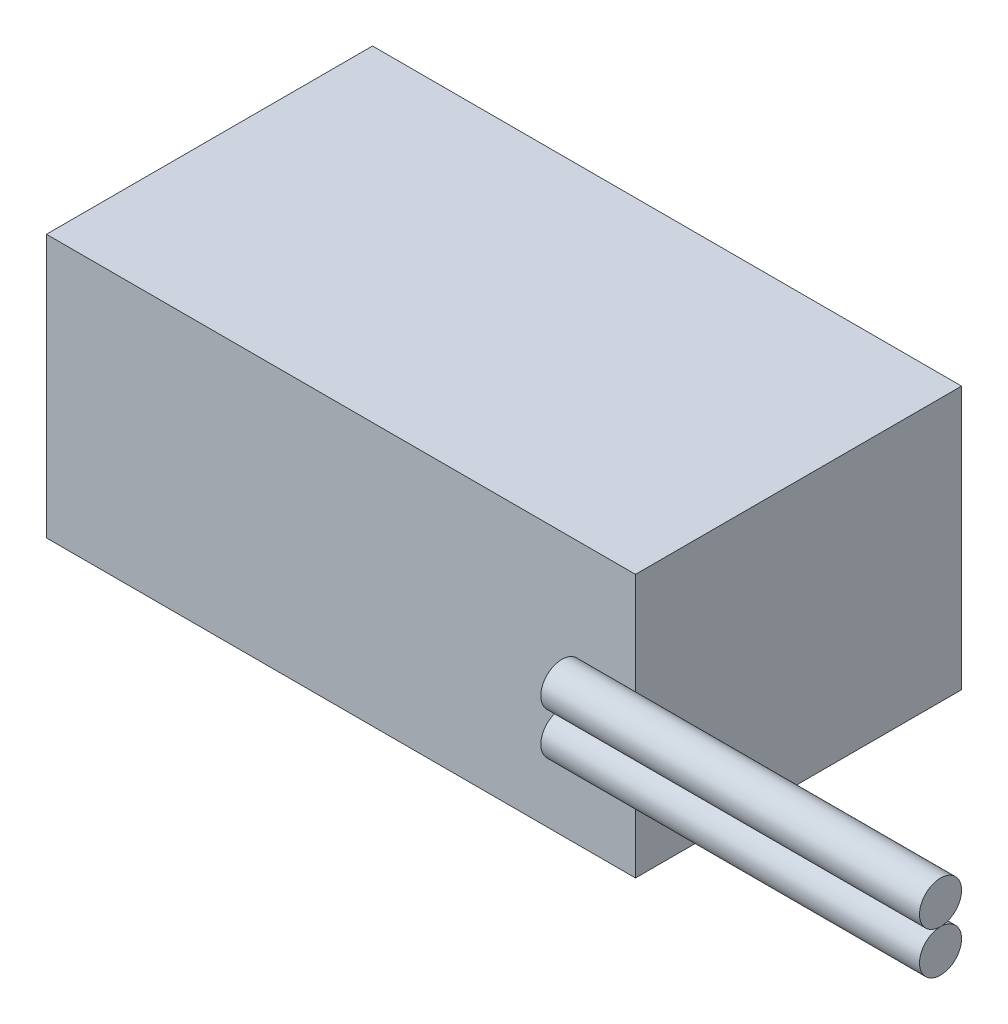
ISO-10303-21;
HEADER;
FILE_DESCRIPTION(('STEP AP214'),'2;1');
FILE_NAME('part.step','',(''),(''),'','','');
FILE_SCHEMA(('AUTOMOTIVE_DESIGN { 1 0 10303 214 1 1 1 1 }'));
ENDSEC;
DATA;
#1=APPLICATION_CONTEXT('core data for automotive mechanical design processes');
#2=APPLICATION_PROTOCOL_DEFINITION('international standard','automotive_design',2000,#1);
#3=PRODUCT_CONTEXT('',#1,'mechanical');
#4=PRODUCT('Part','Part','',(#3));
#5=PRODUCT_RELATED_PRODUCT_CATEGORY('part','',(#4));
#6=PRODUCT_DEFINITION_FORMATION('','',#4);
#7=PRODUCT_DEFINITION_CONTEXT('part definition',#1,'design');
#8=PRODUCT_DEFINITION('design','',#6,#7);
#9=PRODUCT_DEFINITION_SHAPE('','',#8);
#10=(LENGTH_UNIT() NAMED_UNIT(*) SI_UNIT(.MILLI.,.METRE.));
#11=(NAMED_UNIT(*) PLANE_ANGLE_UNIT() SI_UNIT($,.RADIAN.));
#12=(NAMED_UNIT(*) SI_UNIT($,.STERADIAN.) SOLID_ANGLE_UNIT());
#13=UNCERTAINTY_MEASURE_WITH_UNIT(LENGTH_MEASURE(1.E-05),#10,'distance_accuracy_value','');
#14=(GEOMETRIC_REPRESENTATION_CONTEXT(3) GLOBAL_UNCERTAINTY_ASSIGNED_CONTEXT((#13)) GLOBAL_UNIT_ASSIGNED_CONTEXT((#10,
#11,#12)) REPRESENTATION_CONTEXT('',''));
#15=CARTESIAN_POINT('',(0.,0.,0.));
#16=DIRECTION('',(0.,0.,1.));
#17=DIRECTION('',(1.,0.,0.));
#18=AXIS2_PLACEMENT_3D('',#15,#16,#17);
#19=CARTESIAN_POINT('',(59.,-2.,17.5));
#20=DIRECTION('',(-1.,0.,0.));
#21=DIRECTION('',(0.,0.,1.));
#22=AXIS2_PLACEMENT_3D('',#19,#20,#21);
#23=CYLINDRICAL_SURFACE('',#22,2.);
#24=CARTESIAN_POINT('',(59.,-2.,17.5));
#25=DIRECTION('',(1.,0.,0.));
#26=DIRECTION('',(0.,0.,-1.));
#27=AXIS2_PLACEMENT_3D('',#24,#25,#26);
#28=CIRCLE('',#27,2.);
#29=CARTESIAN_POINT('',(59.,-2.,15.5));
#30=VERTEX_POINT('',#29);
#31=EDGE_CURVE('E11',#30,#30,#28,.T.);
#32=ORIENTED_EDGE('',*,*,#31,.F.);
#33=EDGE_LOOP('',(#32));
#34=FACE_BOUND('',#33,.T.);
#35=CARTESIAN_POINT('',(23.,-2.,17.5));
#36=DIRECTION('',(1.,0.,0.));
#37=DIRECTION('',(0.,0.,-1.));
#38=AXIS2_PLACEMENT_3D('',#35,#36,#37);
#39=CIRCLE('',#38,2.);
#40=CARTESIAN_POINT('',(23.,-2.,15.5));
#41=VERTEX_POINT('',#40);
#42=EDGE_CURVE('E50',#41,#41,#39,.T.);
#43=ORIENTED_EDGE('',*,*,#42,.T.);
#44=EDGE_LOOP('',(#43));
#45=FACE_BOUND('',#44,.T.);
#46=ADVANCED_FACE('F44',(#34,#45),#23,.T.);
#47=CARTESIAN_POINT('',(59.,0.,0.));
#48=DIRECTION('',(1.,0.,0.));
#49=DIRECTION('',(0.,0.,-1.));
#50=AXIS2_PLACEMENT_3D('',#47,#48,#49);
#51=PLANE('',#50);
#52=ORIENTED_EDGE('',*,*,#31,.T.);
#53=EDGE_LOOP('',(#52));
#54=FACE_BOUND('',#53,.T.);
#55=ADVANCED_FACE('F59',(#54),#51,.T.);
#56=CARTESIAN_POINT('',(23.,0.,0.));
#57=DIRECTION('',(1.,0.,0.));
#58=DIRECTION('',(0.,0.,-1.));
#59=AXIS2_PLACEMENT_3D('',#56,#57,#58);
#60=PLANE('',#59);
#61=ORIENTED_EDGE('',*,*,#42,.F.);
#62=EDGE_LOOP('',(#61));
#63=FACE_BOUND('',#62,.T.);
#64=ADVANCED_FACE('F57',(#63),#60,.F.);
#65=CLOSED_SHELL('',(#46,#55,#64));
#66=MANIFOLD_SOLID_BREP('B2',#65);
#67=CARTESIAN_POINT('',(59.,2.,17.5));
#68=DIRECTION('',(-1.,0.,0.));
#69=DIRECTION('',(0.,0.,1.));
#70=AXIS2_PLACEMENT_3D('',#67,#68,#69);
#71=CYLINDRICAL_SURFACE('',#70,2.);
#72=CARTESIAN_POINT('',(59.,2.,17.5));
#73=DIRECTION('',(1.,0.,0.));
#74=DIRECTION('',(0.,0.,-1.));
#75=AXIS2_PLACEMENT_3D('',#72,#73,#74);
#76=CIRCLE('',#75,2.);
#77=CARTESIAN_POINT('',(59.,2.,15.5));
#78=VERTEX_POINT('',#77);
#79=EDGE_CURVE('E43',#78,#78,#76,.T.);
#80=ORIENTED_EDGE('',*,*,#79,.F.);
#81=EDGE_LOOP('',(#80));
#82=FACE_BOUND('',#81,.T.);
#83=CARTESIAN_POINT('',(23.,2.,17.5));
#84=DIRECTION('',(1.,0.,0.));
#85=DIRECTION('',(0.,0.,-1.));
#86=AXIS2_PLACEMENT_3D('',#83,#84,#85);
#87=CIRCLE('',#86,2.);
#88=CARTESIAN_POINT('',(23.,2.,15.5));
#89=VERTEX_POINT('',#88);
#90=EDGE_CURVE('E106',#89,#89,#87,.T.);
#91=ORIENTED_EDGE('',*,*,#90,.T.);
#92=EDGE_LOOP('',(#91));
#93=FACE_BOUND('',#92,.T.);
#94=ADVANCED_FACE('F100',(#82,#93),#71,.T.);
#95=CARTESIAN_POINT('',(59.,0.,0.));
#96=DIRECTION('',(1.,0.,0.));
#97=DIRECTION('',(0.,0.,-1.));
#98=AXIS2_PLACEMENT_3D('',#95,#96,#97);
#99=PLANE('',#98);
#100=ORIENTED_EDGE('',*,*,#79,.T.);
#101=EDGE_LOOP('',(#100));
#102=FACE_BOUND('',#101,.T.);
#103=ADVANCED_FACE('F115',(#102),#99,.T.);
#104=CARTESIAN_POINT('',(23.,0.,0.));
#105=DIRECTION('',(1.,0.,0.));
#106=DIRECTION('',(0.,0.,-1.));
#107=AXIS2_PLACEMENT_3D('',#104,#105,#106);
#108=PLANE('',#107);
#109=ORIENTED_EDGE('',*,*,#90,.F.);
#110=EDGE_LOOP('',(#109));
#111=FACE_BOUND('',#110,.T.);
#112=ADVANCED_FACE('F113',(#111),#108,.F.);
#113=CLOSED_SHELL('',(#94,#103,#112));
#114=MANIFOLD_SOLID_BREP('B6',#113);
#115=CARTESIAN_POINT('',(-28.,-12.5,15.5));
#116=DIRECTION('',(1.,0.,0.));
#117=DIRECTION('',(0.,0.,-1.));
#118=AXIS2_PLACEMENT_3D('',#115,#116,#117);
#119=PLANE('',#118);
#120=DIRECTION('',(0.,-1.,0.));
#121=VECTOR('',#120,1.);
#122=CARTESIAN_POINT('',(-28.,-12.5,-15.5));
#123=LINE('',#122,#121);
#124=CARTESIAN_POINT('',(-28.,12.5,-15.5));
#125=VERTEX_POINT('',#124);
#126=CARTESIAN_POINT('',(-28.,-12.5,-15.5));
#127=VERTEX_POINT('',#126);
#128=EDGE_CURVE('E210',#125,#127,#123,.T.);
#129=ORIENTED_EDGE('',*,*,#128,.T.);
#130=DIRECTION('',(0.,0.,-1.));
#131=VECTOR('',#130,1.);
#132=CARTESIAN_POINT('',(-28.,-12.5,15.5));
#133=LINE('',#132,#131);
#134=CARTESIAN_POINT('',(-28.,-12.5,15.5));
#135=VERTEX_POINT('',#134);
#136=EDGE_CURVE('E98',#135,#127,#133,.T.);
#137=ORIENTED_EDGE('',*,*,#136,.F.);
#138=DIRECTION('',(0.,-1.,0.));
#139=VECTOR('',#138,1.);
#140=CARTESIAN_POINT('',(-28.,-12.5,15.5));
#141=LINE('',#140,#139);
#142=CARTESIAN_POINT('',(-28.,12.5,15.5));
#143=VERTEX_POINT('',#142);
#144=EDGE_CURVE('E198',#143,#135,#141,.T.);
#145=ORIENTED_EDGE('',*,*,#144,.F.);
#146=DIRECTION('',(0.,0.,-1.));
#147=VECTOR('',#146,1.);
#148=CARTESIAN_POINT('',(-28.,12.5,15.5));
#149=LINE('',#148,#147);
#150=EDGE_CURVE('E206',#143,#125,#149,.T.);
#151=ORIENTED_EDGE('',*,*,#150,.T.);
#152=EDGE_LOOP('',(#129,#137,#145,#151));
#153=FACE_BOUND('',#152,.T.);
#154=ADVANCED_FACE('F147',(#153),#119,.F.);
#155=CARTESIAN_POINT('',(28.,-12.5,15.5));
#156=DIRECTION('',(0.,1.,0.));
#157=DIRECTION('',(-1.,0.,0.));
#158=AXIS2_PLACEMENT_3D('',#155,#156,#157);
#159=PLANE('',#158);
#160=DIRECTION('',(1.,0.,0.));
#161=VECTOR('',#160,1.);
#162=CARTESIAN_POINT('',(28.,-12.5,-15.5));
#163=LINE('',#162,#161);
#164=CARTESIAN_POINT('',(28.,-12.5,-15.5));
#165=VERTEX_POINT('',#164);
#166=EDGE_CURVE('E202',#127,#165,#163,.T.);
#167=ORIENTED_EDGE('',*,*,#166,.T.);
#168=DIRECTION('',(0.,0.,-1.));
#169=VECTOR('',#168,1.);
#170=CARTESIAN_POINT('',(28.,-12.5,15.5));
#171=LINE('',#170,#169);
#172=CARTESIAN_POINT('',(28.,-12.5,15.5));
#173=VERTEX_POINT('',#172);
#174=EDGE_CURVE('E155',#173,#165,#171,.T.);
#175=ORIENTED_EDGE('',*,*,#174,.F.);
#176=DIRECTION('',(1.,0.,0.));
#177=VECTOR('',#176,1.);
#178=CARTESIAN_POINT('',(28.,-12.5,15.5));
#179=LINE('',#178,#177);
#180=EDGE_CURVE('E193',#135,#173,#179,.T.);
#181=ORIENTED_EDGE('',*,*,#180,.F.);
#182=ORIENTED_EDGE('',*,*,#136,.T.);
#183=EDGE_LOOP('',(#167,#175,#181,#182));
#184=FACE_BOUND('',#183,.T.);
#185=ADVANCED_FACE('F201',(#184),#159,.F.);
#186=CARTESIAN_POINT('',(28.,-12.5,15.5));
#187=DIRECTION('',(-1.,0.,0.));
#188=DIRECTION('',(0.,0.,1.));
#189=AXIS2_PLACEMENT_3D('',#186,#187,#188);
#190=PLANE('',#189);
#191=DIRECTION('',(0.,1.,0.));
#192=VECTOR('',#191,1.);
#193=CARTESIAN_POINT('',(28.,-12.5,-15.5));
#194=LINE('',#193,#192);
#195=CARTESIAN_POINT('',(28.,12.5,-15.5));
#196=VERTEX_POINT('',#195);
#197=EDGE_CURVE('E180',#165,#196,#194,.T.);
#198=ORIENTED_EDGE('',*,*,#197,.T.);
#199=DIRECTION('',(0.,0.,-1.));
#200=VECTOR('',#199,1.);
#201=CARTESIAN_POINT('',(28.,12.5,15.5));
#202=LINE('',#201,#200);
#203=CARTESIAN_POINT('',(28.,12.5,15.5));
#204=VERTEX_POINT('',#203);
#205=EDGE_CURVE('E203',#204,#196,#202,.T.);
#206=ORIENTED_EDGE('',*,*,#205,.F.);
#207=DIRECTION('',(0.,1.,0.));
#208=VECTOR('',#207,1.);
#209=CARTESIAN_POINT('',(28.,-12.5,15.5));
#210=LINE('',#209,#208);
#211=EDGE_CURVE('E196',#173,#204,#210,.T.);
#212=ORIENTED_EDGE('',*,*,#211,.F.);
#213=ORIENTED_EDGE('',*,*,#174,.T.);
#214=EDGE_LOOP('',(#198,#206,#212,#213));
#215=FACE_BOUND('',#214,.T.);
#216=ADVANCED_FACE('F204',(#215),#190,.F.);
#217=CARTESIAN_POINT('',(28.,12.5,15.5));
#218=DIRECTION('',(0.,-1.,0.));
#219=DIRECTION('',(1.,0.,0.));
#220=AXIS2_PLACEMENT_3D('',#217,#218,#219);
#221=PLANE('',#220);
#222=DIRECTION('',(-1.,0.,0.));
#223=VECTOR('',#222,1.);
#224=CARTESIAN_POINT('',(28.,12.5,-15.5));
#225=LINE('',#224,#223);
#226=EDGE_CURVE('E186',#196,#125,#225,.T.);
#227=ORIENTED_EDGE('',*,*,#226,.T.);
#228=ORIENTED_EDGE('',*,*,#150,.F.);
#229=DIRECTION('',(-1.,0.,0.));
#230=VECTOR('',#229,1.);
#231=CARTESIAN_POINT('',(28.,12.5,15.5));
#232=LINE('',#231,#230);
#233=EDGE_CURVE('E163',#204,#143,#232,.T.);
#234=ORIENTED_EDGE('',*,*,#233,.F.);
#235=ORIENTED_EDGE('',*,*,#205,.T.);
#236=EDGE_LOOP('',(#227,#228,#234,#235));
#237=FACE_BOUND('',#236,.T.);
#238=ADVANCED_FACE('F217',(#237),#221,.F.);
#239=CARTESIAN_POINT('',(0.,0.,15.5));
#240=DIRECTION('',(0.,0.,1.));
#241=DIRECTION('',(1.,0.,0.));
#242=AXIS2_PLACEMENT_3D('',#239,#240,#241);
#243=PLANE('',#242);
#244=ORIENTED_EDGE('',*,*,#211,.T.);
#245=ORIENTED_EDGE('',*,*,#233,.T.);
#246=ORIENTED_EDGE('',*,*,#144,.T.);
#247=ORIENTED_EDGE('',*,*,#180,.T.);
#248=EDGE_LOOP('',(#244,#245,#246,#247));
#249=FACE_BOUND('',#248,.T.);
#250=ADVANCED_FACE('F194',(#249),#243,.T.);
#251=CARTESIAN_POINT('',(0.,0.,-15.5));
#252=DIRECTION('',(0.,0.,1.));
#253=DIRECTION('',(1.,0.,0.));
#254=AXIS2_PLACEMENT_3D('',#251,#252,#253);
#255=PLANE('',#254);
#256=ORIENTED_EDGE('',*,*,#128,.F.);
#257=ORIENTED_EDGE('',*,*,#226,.F.);
#258=ORIENTED_EDGE('',*,*,#197,.F.);
#259=ORIENTED_EDGE('',*,*,#166,.F.);
#260=EDGE_LOOP('',(#256,#257,#258,#259));
#261=FACE_BOUND('',#260,.T.);
#262=ADVANCED_FACE('F220',(#261),#255,.F.);
#263=CLOSED_SHELL('',(#154,#185,#216,#238,#250,#262));
#264=MANIFOLD_SOLID_BREP('B38',#263);
#265=ADVANCED_BREP_SHAPE_REPRESENTATION('',(#18,#66,#114,#264),#14);
#266=SHAPE_DEFINITION_REPRESENTATION(#9,#265);
ENDSEC;
END-ISO-10303-21;
